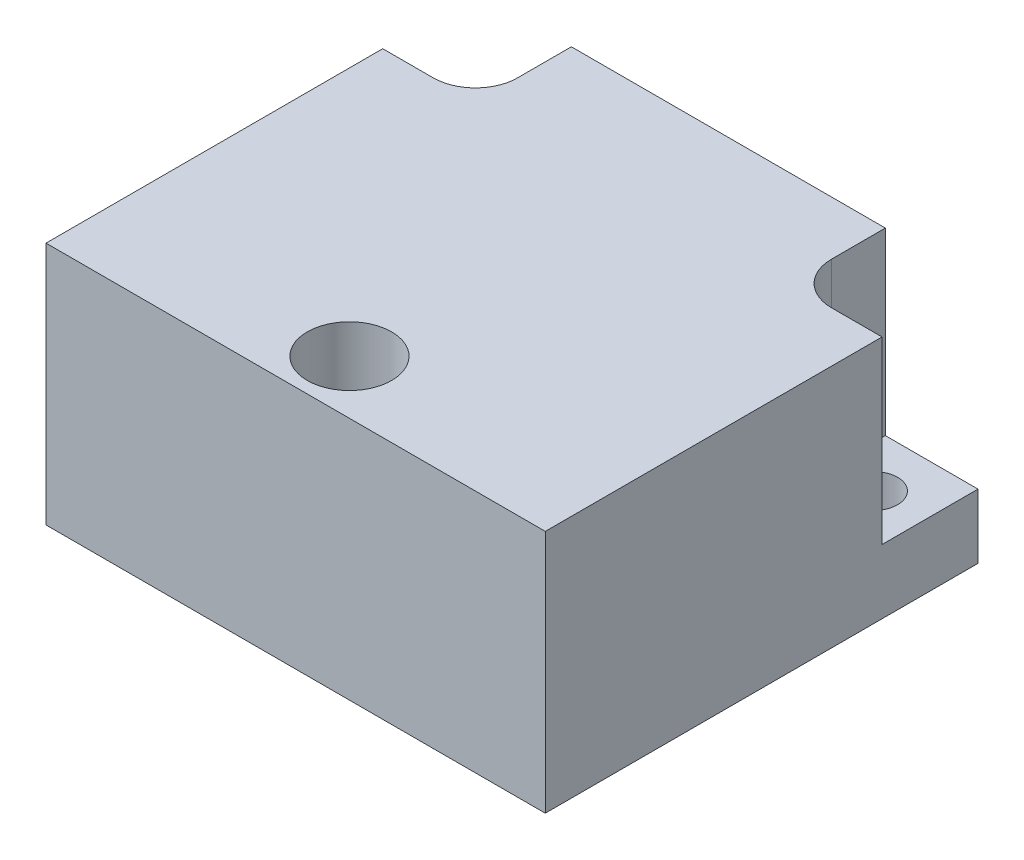
ISO-10303-21;
HEADER;
FILE_DESCRIPTION(('STEP AP214'),'2;1');
FILE_NAME('part.step','',(''),(''),'','','');
FILE_SCHEMA(('AUTOMOTIVE_DESIGN { 1 0 10303 214 1 1 1 1 }'));
ENDSEC;
DATA;
#1=APPLICATION_CONTEXT('core data for automotive mechanical design processes');
#2=APPLICATION_PROTOCOL_DEFINITION('international standard','automotive_design',2000,#1);
#3=PRODUCT_CONTEXT('',#1,'mechanical');
#4=PRODUCT('Part','Part','',(#3));
#5=PRODUCT_RELATED_PRODUCT_CATEGORY('part','',(#4));
#6=PRODUCT_DEFINITION_FORMATION('','',#4);
#7=PRODUCT_DEFINITION_CONTEXT('part definition',#1,'design');
#8=PRODUCT_DEFINITION('design','',#6,#7);
#9=PRODUCT_DEFINITION_SHAPE('','',#8);
#10=(LENGTH_UNIT() NAMED_UNIT(*) SI_UNIT(.MILLI.,.METRE.));
#11=(NAMED_UNIT(*) PLANE_ANGLE_UNIT() SI_UNIT($,.RADIAN.));
#12=(NAMED_UNIT(*) SI_UNIT($,.STERADIAN.) SOLID_ANGLE_UNIT());
#13=UNCERTAINTY_MEASURE_WITH_UNIT(LENGTH_MEASURE(1.E-05),#10,'distance_accuracy_value','');
#14=(GEOMETRIC_REPRESENTATION_CONTEXT(3) GLOBAL_UNCERTAINTY_ASSIGNED_CONTEXT((#13)) GLOBAL_UNIT_ASSIGNED_CONTEXT((#10,
#11,#12)) REPRESENTATION_CONTEXT('',''));
#15=CARTESIAN_POINT('',(0.,0.,0.));
#16=DIRECTION('',(0.,0.,1.));
#17=DIRECTION('',(1.,0.,0.));
#18=AXIS2_PLACEMENT_3D('',#15,#16,#17);
#19=CARTESIAN_POINT('',(-17.95,0.,-14.65));
#20=DIRECTION('',(0.,-1.,0.));
#21=DIRECTION('',(0.,0.,-1.));
#22=AXIS2_PLACEMENT_3D('',#19,#20,#21);
#23=CYLINDRICAL_SURFACE('',#22,2.15);
#24=CARTESIAN_POINT('',(-17.95,0.,-14.65));
#25=DIRECTION('',(0.,-1.,0.));
#26=DIRECTION('',(0.,0.,-1.));
#27=AXIS2_PLACEMENT_3D('',#24,#25,#26);
#28=CIRCLE('',#27,2.15);
#29=CARTESIAN_POINT('',(-17.95,0.,-16.8));
#30=VERTEX_POINT('',#29);
#31=EDGE_CURVE('E205',#30,#30,#28,.T.);
#32=ORIENTED_EDGE('',*,*,#31,.T.);
#33=EDGE_LOOP('',(#32));
#34=FACE_BOUND('',#33,.T.);
#35=CARTESIAN_POINT('',(-17.95,5.8,-14.65));
#36=DIRECTION('',(0.,1.,0.));
#37=DIRECTION('',(0.,0.,1.));
#38=AXIS2_PLACEMENT_3D('',#35,#36,#37);
#39=CIRCLE('',#38,2.15);
#40=CARTESIAN_POINT('',(-17.95,5.8,-12.5));
#41=VERTEX_POINT('',#40);
#42=EDGE_CURVE('E40',#41,#41,#39,.F.);
#43=ORIENTED_EDGE('',*,*,#42,.F.);
#44=EDGE_LOOP('',(#43));
#45=FACE_BOUND('',#44,.T.);
#46=ADVANCED_FACE('F36',(#34,#45),#23,.F.);
#47=CARTESIAN_POINT('',(0.,0.,14.65));
#48=DIRECTION('',(0.,-1.,0.));
#49=DIRECTION('',(0.,0.,-1.));
#50=AXIS2_PLACEMENT_3D('',#47,#48,#49);
#51=CYLINDRICAL_SURFACE('',#50,2.15);
#52=CARTESIAN_POINT('',(0.,0.,14.65));
#53=DIRECTION('',(0.,-1.,0.));
#54=DIRECTION('',(0.,0.,-1.));
#55=AXIS2_PLACEMENT_3D('',#52,#53,#54);
#56=CIRCLE('',#55,2.15);
#57=CARTESIAN_POINT('',(0.,0.,12.5));
#58=VERTEX_POINT('',#57);
#59=EDGE_CURVE('E199',#58,#58,#56,.T.);
#60=ORIENTED_EDGE('',*,*,#59,.T.);
#61=EDGE_LOOP('',(#60));
#62=FACE_BOUND('',#61,.T.);
#63=CARTESIAN_POINT('',(0.,5.8,14.65));
#64=DIRECTION('',(0.,1.,0.));
#65=DIRECTION('',(0.,0.,1.));
#66=AXIS2_PLACEMENT_3D('',#63,#64,#65);
#67=CIRCLE('',#66,2.15);
#68=CARTESIAN_POINT('',(0.,5.8,16.8));
#69=VERTEX_POINT('',#68);
#70=EDGE_CURVE('E168',#69,#69,#67,.F.);
#71=ORIENTED_EDGE('',*,*,#70,.F.);
#72=EDGE_LOOP('',(#71));
#73=FACE_BOUND('',#72,.T.);
#74=ADVANCED_FACE('F241',(#62,#73),#51,.F.);
#75=CARTESIAN_POINT('',(17.95,0.,-14.65));
#76=DIRECTION('',(0.,-1.,0.));
#77=DIRECTION('',(0.,0.,-1.));
#78=AXIS2_PLACEMENT_3D('',#75,#76,#77);
#79=CYLINDRICAL_SURFACE('',#78,2.15);
#80=CARTESIAN_POINT('',(17.95,0.,-14.65));
#81=DIRECTION('',(0.,-1.,0.));
#82=DIRECTION('',(0.,0.,-1.));
#83=AXIS2_PLACEMENT_3D('',#80,#81,#82);
#84=CIRCLE('',#83,2.15);
#85=CARTESIAN_POINT('',(17.95,0.,-16.8));
#86=VERTEX_POINT('',#85);
#87=EDGE_CURVE('E202',#86,#86,#84,.T.);
#88=ORIENTED_EDGE('',*,*,#87,.T.);
#89=EDGE_LOOP('',(#88));
#90=FACE_BOUND('',#89,.T.);
#91=CARTESIAN_POINT('',(17.95,5.8,-14.65));
#92=DIRECTION('',(0.,1.,0.));
#93=DIRECTION('',(0.,0.,1.));
#94=AXIS2_PLACEMENT_3D('',#91,#92,#93);
#95=CIRCLE('',#94,2.15);
#96=CARTESIAN_POINT('',(17.95,5.8,-12.5));
#97=VERTEX_POINT('',#96);
#98=EDGE_CURVE('E187',#97,#97,#95,.F.);
#99=ORIENTED_EDGE('',*,*,#98,.F.);
#100=EDGE_LOOP('',(#99));
#101=FACE_BOUND('',#100,.T.);
#102=ADVANCED_FACE('F243',(#90,#101),#79,.F.);
#103=CARTESIAN_POINT('',(22.5,22.,19.5));
#104=DIRECTION('',(-1.,0.,0.));
#105=DIRECTION('',(0.,0.,1.));
#106=AXIS2_PLACEMENT_3D('',#103,#104,#105);
#107=PLANE('',#106);
#108=DIRECTION('',(0.,0.,-1.));
#109=VECTOR('',#108,1.);
#110=CARTESIAN_POINT('',(22.5,5.8,19.5));
#111=LINE('',#110,#109);
#112=CARTESIAN_POINT('',(22.5,5.8,-10.85));
#113=VERTEX_POINT('',#112);
#114=CARTESIAN_POINT('',(22.5,5.8,-19.5));
#115=VERTEX_POINT('',#114);
#116=EDGE_CURVE('E191',#113,#115,#111,.T.);
#117=ORIENTED_EDGE('',*,*,#116,.F.);
#118=DIRECTION('',(0.,1.,0.));
#119=VECTOR('',#118,1.);
#120=CARTESIAN_POINT('',(22.5,22.,-10.85));
#121=LINE('',#120,#119);
#122=CARTESIAN_POINT('',(22.5,22.,-10.85));
#123=VERTEX_POINT('',#122);
#124=EDGE_CURVE('E193',#113,#123,#121,.T.);
#125=ORIENTED_EDGE('',*,*,#124,.T.);
#126=DIRECTION('',(0.,0.,-1.));
#127=VECTOR('',#126,1.);
#128=CARTESIAN_POINT('',(22.5,22.,19.5));
#129=LINE('',#128,#127);
#130=CARTESIAN_POINT('',(22.5,22.,19.5));
#131=VERTEX_POINT('',#130);
#132=EDGE_CURVE('E209',#131,#123,#129,.T.);
#133=ORIENTED_EDGE('',*,*,#132,.F.);
#134=DIRECTION('',(0.,-1.,0.));
#135=VECTOR('',#134,1.);
#136=CARTESIAN_POINT('',(22.5,22.,19.5));
#137=LINE('',#136,#135);
#138=CARTESIAN_POINT('',(22.5,0.,19.5));
#139=VERTEX_POINT('',#138);
#140=EDGE_CURVE('E220',#131,#139,#137,.T.);
#141=ORIENTED_EDGE('',*,*,#140,.T.);
#142=DIRECTION('',(0.,0.,-1.));
#143=VECTOR('',#142,1.);
#144=CARTESIAN_POINT('',(22.5,0.,19.5));
#145=LINE('',#144,#143);
#146=CARTESIAN_POINT('',(22.5,0.,-19.5));
#147=VERTEX_POINT('',#146);
#148=EDGE_CURVE('E208',#139,#147,#145,.T.);
#149=ORIENTED_EDGE('',*,*,#148,.T.);
#150=DIRECTION('',(0.,-1.,0.));
#151=VECTOR('',#150,1.);
#152=CARTESIAN_POINT('',(22.5,22.,-19.5));
#153=LINE('',#152,#151);
#154=EDGE_CURVE('E11',#115,#147,#153,.T.);
#155=ORIENTED_EDGE('',*,*,#154,.F.);
#156=EDGE_LOOP('',(#117,#125,#133,#141,#149,#155));
#157=FACE_BOUND('',#156,.T.);
#158=ADVANCED_FACE('F38',(#157),#107,.F.);
#159=CARTESIAN_POINT('',(-22.5,22.,-19.5));
#160=DIRECTION('',(0.,0.,1.));
#161=DIRECTION('',(1.,0.,0.));
#162=AXIS2_PLACEMENT_3D('',#159,#160,#161);
#163=PLANE('',#162);
#164=DIRECTION('',(-1.,0.,0.));
#165=VECTOR('',#164,1.);
#166=CARTESIAN_POINT('',(-22.5,5.8,-19.5));
#167=LINE('',#166,#165);
#168=CARTESIAN_POINT('',(-14.15,5.8,-19.5));
#169=VERTEX_POINT('',#168);
#170=CARTESIAN_POINT('',(-22.5,5.8,-19.5));
#171=VERTEX_POINT('',#170);
#172=EDGE_CURVE('E158',#169,#171,#167,.T.);
#173=ORIENTED_EDGE('',*,*,#172,.F.);
#174=DIRECTION('',(0.,1.,0.));
#175=VECTOR('',#174,1.);
#176=CARTESIAN_POINT('',(-14.15,22.,-19.5));
#177=LINE('',#176,#175);
#178=CARTESIAN_POINT('',(-14.15,22.,-19.5));
#179=VERTEX_POINT('',#178);
#180=EDGE_CURVE('E140',#169,#179,#177,.T.);
#181=ORIENTED_EDGE('',*,*,#180,.T.);
#182=DIRECTION('',(-1.,0.,0.));
#183=VECTOR('',#182,1.);
#184=CARTESIAN_POINT('',(-22.5,22.,-19.5));
#185=LINE('',#184,#183);
#186=CARTESIAN_POINT('',(14.15,22.,-19.5));
#187=VERTEX_POINT('',#186);
#188=EDGE_CURVE('E212',#187,#179,#185,.T.);
#189=ORIENTED_EDGE('',*,*,#188,.F.);
#190=DIRECTION('',(0.,-1.,0.));
#191=VECTOR('',#190,1.);
#192=CARTESIAN_POINT('',(14.15,22.,-19.5));
#193=LINE('',#192,#191);
#194=CARTESIAN_POINT('',(14.15,5.8,-19.5));
#195=VERTEX_POINT('',#194);
#196=EDGE_CURVE('E196',#187,#195,#193,.T.);
#197=ORIENTED_EDGE('',*,*,#196,.T.);
#198=DIRECTION('',(-1.,0.,0.));
#199=VECTOR('',#198,1.);
#200=CARTESIAN_POINT('',(-22.5,5.8,-19.5));
#201=LINE('',#200,#199);
#202=EDGE_CURVE('E189',#115,#195,#201,.T.);
#203=ORIENTED_EDGE('',*,*,#202,.F.);
#204=ORIENTED_EDGE('',*,*,#154,.T.);
#205=DIRECTION('',(-1.,0.,0.));
#206=VECTOR('',#205,1.);
#207=CARTESIAN_POINT('',(-22.5,0.,-19.5));
#208=LINE('',#207,#206);
#209=CARTESIAN_POINT('',(-22.5,0.,-19.5));
#210=VERTEX_POINT('',#209);
#211=EDGE_CURVE('E223',#147,#210,#208,.T.);
#212=ORIENTED_EDGE('',*,*,#211,.T.);
#213=DIRECTION('',(0.,-1.,0.));
#214=VECTOR('',#213,1.);
#215=CARTESIAN_POINT('',(-22.5,22.,-19.5));
#216=LINE('',#215,#214);
#217=EDGE_CURVE('E45',#171,#210,#216,.T.);
#218=ORIENTED_EDGE('',*,*,#217,.F.);
#219=EDGE_LOOP('',(#173,#181,#189,#197,#203,#204,#212,#218));
#220=FACE_BOUND('',#219,.T.);
#221=ADVANCED_FACE('F273',(#220),#163,.F.);
#222=CARTESIAN_POINT('',(-22.5,22.,19.5));
#223=DIRECTION('',(1.,0.,0.));
#224=DIRECTION('',(0.,0.,-1.));
#225=AXIS2_PLACEMENT_3D('',#222,#223,#224);
#226=PLANE('',#225);
#227=DIRECTION('',(0.,0.,1.));
#228=VECTOR('',#227,1.);
#229=CARTESIAN_POINT('',(-22.5,22.,19.5));
#230=LINE('',#229,#228);
#231=CARTESIAN_POINT('',(-22.5,22.,-10.85));
#232=VERTEX_POINT('',#231);
#233=CARTESIAN_POINT('',(-22.5,22.,19.5));
#234=VERTEX_POINT('',#233);
#235=EDGE_CURVE('E216',#232,#234,#230,.T.);
#236=ORIENTED_EDGE('',*,*,#235,.F.);
#237=DIRECTION('',(0.,-1.,0.));
#238=VECTOR('',#237,1.);
#239=CARTESIAN_POINT('',(-22.5,22.,-10.85));
#240=LINE('',#239,#238);
#241=CARTESIAN_POINT('',(-22.5,5.8,-10.85));
#242=VERTEX_POINT('',#241);
#243=EDGE_CURVE('E161',#232,#242,#240,.T.);
#244=ORIENTED_EDGE('',*,*,#243,.T.);
#245=DIRECTION('',(0.,0.,1.));
#246=VECTOR('',#245,1.);
#247=CARTESIAN_POINT('',(-22.5,5.8,19.5));
#248=LINE('',#247,#246);
#249=EDGE_CURVE('E156',#171,#242,#248,.T.);
#250=ORIENTED_EDGE('',*,*,#249,.F.);
#251=ORIENTED_EDGE('',*,*,#217,.T.);
#252=DIRECTION('',(0.,0.,1.));
#253=VECTOR('',#252,1.);
#254=CARTESIAN_POINT('',(-22.5,0.,19.5));
#255=LINE('',#254,#253);
#256=CARTESIAN_POINT('',(-22.5,0.,19.5));
#257=VERTEX_POINT('',#256);
#258=EDGE_CURVE('E226',#210,#257,#255,.T.);
#259=ORIENTED_EDGE('',*,*,#258,.T.);
#260=DIRECTION('',(0.,-1.,0.));
#261=VECTOR('',#260,1.);
#262=CARTESIAN_POINT('',(-22.5,22.,19.5));
#263=LINE('',#262,#261);
#264=EDGE_CURVE('E231',#234,#257,#263,.T.);
#265=ORIENTED_EDGE('',*,*,#264,.F.);
#266=EDGE_LOOP('',(#236,#244,#250,#251,#259,#265));
#267=FACE_BOUND('',#266,.T.);
#268=ADVANCED_FACE('F270',(#267),#226,.F.);
#269=CARTESIAN_POINT('',(-22.5,22.,19.5));
#270=DIRECTION('',(0.,0.,-1.));
#271=DIRECTION('',(-1.,0.,0.));
#272=AXIS2_PLACEMENT_3D('',#269,#270,#271);
#273=PLANE('',#272);
#274=DIRECTION('',(1.,0.,0.));
#275=VECTOR('',#274,1.);
#276=CARTESIAN_POINT('',(-22.5,0.,19.5));
#277=LINE('',#276,#275);
#278=EDGE_CURVE('E213',#257,#139,#277,.T.);
#279=ORIENTED_EDGE('',*,*,#278,.T.);
#280=ORIENTED_EDGE('',*,*,#140,.F.);
#281=DIRECTION('',(1.,0.,0.));
#282=VECTOR('',#281,1.);
#283=CARTESIAN_POINT('',(-22.5,22.,19.5));
#284=LINE('',#283,#282);
#285=EDGE_CURVE('E218',#234,#131,#284,.T.);
#286=ORIENTED_EDGE('',*,*,#285,.F.);
#287=ORIENTED_EDGE('',*,*,#264,.T.);
#288=EDGE_LOOP('',(#279,#280,#286,#287));
#289=FACE_BOUND('',#288,.T.);
#290=ADVANCED_FACE('F262',(#289),#273,.F.);
#291=CARTESIAN_POINT('',(0.,22.,0.));
#292=DIRECTION('',(0.,-1.,0.));
#293=DIRECTION('',(0.,0.,-1.));
#294=AXIS2_PLACEMENT_3D('',#291,#292,#293);
#295=PLANE('',#294);
#296=CARTESIAN_POINT('',(0.,22.,14.65));
#297=DIRECTION('',(0.,1.,0.));
#298=DIRECTION('',(0.,0.,1.));
#299=AXIS2_PLACEMENT_3D('',#296,#297,#298);
#300=CIRCLE('',#299,3.8);
#301=CARTESIAN_POINT('',(0.,22.,18.45));
#302=VERTEX_POINT('',#301);
#303=EDGE_CURVE('E164',#302,#302,#300,.T.);
#304=ORIENTED_EDGE('',*,*,#303,.F.);
#305=EDGE_LOOP('',(#304));
#306=FACE_BOUND('',#305,.T.);
#307=CARTESIAN_POINT('',(-17.95,22.,-14.65));
#308=DIRECTION('',(0.,1.,0.));
#309=DIRECTION('',(0.,0.,1.));
#310=AXIS2_PLACEMENT_3D('',#307,#308,#309);
#311=CIRCLE('',#310,3.8);
#312=CARTESIAN_POINT('',(-17.95,22.,-10.85));
#313=VERTEX_POINT('',#312);
#314=CARTESIAN_POINT('',(-14.15,22.,-14.65));
#315=VERTEX_POINT('',#314);
#316=EDGE_CURVE('E53',#313,#315,#311,.T.);
#317=ORIENTED_EDGE('',*,*,#316,.F.);
#318=DIRECTION('',(1.,0.,0.));
#319=VECTOR('',#318,1.);
#320=CARTESIAN_POINT('',(-25.55,22.,-10.85));
#321=LINE('',#320,#319);
#322=EDGE_CURVE('E147',#232,#313,#321,.T.);
#323=ORIENTED_EDGE('',*,*,#322,.F.);
#324=ORIENTED_EDGE('',*,*,#235,.T.);
#325=ORIENTED_EDGE('',*,*,#285,.T.);
#326=ORIENTED_EDGE('',*,*,#132,.T.);
#327=DIRECTION('',(1.,0.,0.));
#328=VECTOR('',#327,1.);
#329=CARTESIAN_POINT('',(17.95,22.,-10.85));
#330=LINE('',#329,#328);
#331=CARTESIAN_POINT('',(17.95,22.,-10.85));
#332=VERTEX_POINT('',#331);
#333=EDGE_CURVE('E182',#332,#123,#330,.T.);
#334=ORIENTED_EDGE('',*,*,#333,.F.);
#335=CARTESIAN_POINT('',(17.95,22.,-14.65));
#336=DIRECTION('',(0.,1.,0.));
#337=DIRECTION('',(0.,0.,1.));
#338=AXIS2_PLACEMENT_3D('',#335,#336,#337);
#339=CIRCLE('',#338,3.8);
#340=CARTESIAN_POINT('',(14.15,22.,-14.65));
#341=VERTEX_POINT('',#340);
#342=EDGE_CURVE('E61',#341,#332,#339,.T.);
#343=ORIENTED_EDGE('',*,*,#342,.F.);
#344=DIRECTION('',(0.,0.,1.));
#345=VECTOR('',#344,1.);
#346=CARTESIAN_POINT('',(14.15,22.,-22.25));
#347=LINE('',#346,#345);
#348=EDGE_CURVE('E175',#187,#341,#347,.T.);
#349=ORIENTED_EDGE('',*,*,#348,.F.);
#350=ORIENTED_EDGE('',*,*,#188,.T.);
#351=DIRECTION('',(0.,0.,-1.));
#352=VECTOR('',#351,1.);
#353=CARTESIAN_POINT('',(-14.15,22.,-14.65));
#354=LINE('',#353,#352);
#355=EDGE_CURVE('E149',#315,#179,#354,.T.);
#356=ORIENTED_EDGE('',*,*,#355,.F.);
#357=EDGE_LOOP('',(#317,#323,#324,#325,#326,#334,#343,#349,#350,#356));
#358=FACE_BOUND('',#357,.T.);
#359=ADVANCED_FACE('F258',(#306,#358),#295,.F.);
#360=CARTESIAN_POINT('',(0.,0.,0.));
#361=DIRECTION('',(0.,-1.,0.));
#362=DIRECTION('',(0.,0.,-1.));
#363=AXIS2_PLACEMENT_3D('',#360,#361,#362);
#364=PLANE('',#363);
#365=ORIENTED_EDGE('',*,*,#59,.F.);
#366=EDGE_LOOP('',(#365));
#367=FACE_BOUND('',#366,.T.);
#368=ORIENTED_EDGE('',*,*,#87,.F.);
#369=EDGE_LOOP('',(#368));
#370=FACE_BOUND('',#369,.T.);
#371=ORIENTED_EDGE('',*,*,#31,.F.);
#372=EDGE_LOOP('',(#371));
#373=FACE_BOUND('',#372,.T.);
#374=ORIENTED_EDGE('',*,*,#148,.F.);
#375=ORIENTED_EDGE('',*,*,#278,.F.);
#376=ORIENTED_EDGE('',*,*,#258,.F.);
#377=ORIENTED_EDGE('',*,*,#211,.F.);
#378=EDGE_LOOP('',(#374,#375,#376,#377));
#379=FACE_BOUND('',#378,.T.);
#380=ADVANCED_FACE('F261',(#367,#370,#373,#379),#364,.T.);
#381=CARTESIAN_POINT('',(14.15,5.8,-22.25));
#382=DIRECTION('',(-1.,0.,0.));
#383=DIRECTION('',(0.,0.,1.));
#384=AXIS2_PLACEMENT_3D('',#381,#382,#383);
#385=PLANE('',#384);
#386=ORIENTED_EDGE('',*,*,#348,.T.);
#387=DIRECTION('',(0.,1.,0.));
#388=VECTOR('',#387,1.);
#389=CARTESIAN_POINT('',(14.15,5.8,-14.65));
#390=LINE('',#389,#388);
#391=CARTESIAN_POINT('',(14.15,5.8,-14.65));
#392=VERTEX_POINT('',#391);
#393=EDGE_CURVE('E185',#392,#341,#390,.T.);
#394=ORIENTED_EDGE('',*,*,#393,.F.);
#395=DIRECTION('',(0.,0.,1.));
#396=VECTOR('',#395,1.);
#397=CARTESIAN_POINT('',(14.15,5.8,-22.25));
#398=LINE('',#397,#396);
#399=EDGE_CURVE('E178',#195,#392,#398,.T.);
#400=ORIENTED_EDGE('',*,*,#399,.F.);
#401=ORIENTED_EDGE('',*,*,#196,.F.);
#402=EDGE_LOOP('',(#386,#394,#400,#401));
#403=FACE_BOUND('',#402,.T.);
#404=ADVANCED_FACE('F266',(#403),#385,.F.);
#405=CARTESIAN_POINT('',(17.95,5.8,-10.85));
#406=DIRECTION('',(0.,0.,1.));
#407=DIRECTION('',(1.,0.,0.));
#408=AXIS2_PLACEMENT_3D('',#405,#406,#407);
#409=PLANE('',#408);
#410=DIRECTION('',(1.,0.,0.));
#411=VECTOR('',#410,1.);
#412=CARTESIAN_POINT('',(17.95,5.8,-10.85));
#413=LINE('',#412,#411);
#414=CARTESIAN_POINT('',(17.95,5.8,-10.85));
#415=VERTEX_POINT('',#414);
#416=EDGE_CURVE('E174',#415,#113,#413,.T.);
#417=ORIENTED_EDGE('',*,*,#416,.F.);
#418=DIRECTION('',(0.,1.,0.));
#419=VECTOR('',#418,1.);
#420=CARTESIAN_POINT('',(17.95,5.8,-10.85));
#421=LINE('',#420,#419);
#422=EDGE_CURVE('E180',#415,#332,#421,.T.);
#423=ORIENTED_EDGE('',*,*,#422,.T.);
#424=ORIENTED_EDGE('',*,*,#333,.T.);
#425=ORIENTED_EDGE('',*,*,#124,.F.);
#426=EDGE_LOOP('',(#417,#423,#424,#425));
#427=FACE_BOUND('',#426,.T.);
#428=ADVANCED_FACE('F311',(#427),#409,.F.);
#429=CARTESIAN_POINT('',(17.95,5.8,-14.65));
#430=DIRECTION('',(0.,1.,0.));
#431=DIRECTION('',(0.,0.,1.));
#432=AXIS2_PLACEMENT_3D('',#429,#430,#431);
#433=PLANE('',#432);
#434=ORIENTED_EDGE('',*,*,#98,.T.);
#435=EDGE_LOOP('',(#434));
#436=FACE_BOUND('',#435,.T.);
#437=ORIENTED_EDGE('',*,*,#116,.T.);
#438=ORIENTED_EDGE('',*,*,#202,.T.);
#439=ORIENTED_EDGE('',*,*,#399,.T.);
#440=CARTESIAN_POINT('',(17.95,5.8,-14.65));
#441=DIRECTION('',(0.,1.,0.));
#442=DIRECTION('',(0.,0.,1.));
#443=AXIS2_PLACEMENT_3D('',#440,#441,#442);
#444=CIRCLE('',#443,3.8);
#445=EDGE_CURVE('E171',#392,#415,#444,.T.);
#446=ORIENTED_EDGE('',*,*,#445,.T.);
#447=ORIENTED_EDGE('',*,*,#416,.T.);
#448=EDGE_LOOP('',(#437,#438,#439,#446,#447));
#449=FACE_BOUND('',#448,.T.);
#450=ADVANCED_FACE('F298',(#436,#449),#433,.T.);
#451=CARTESIAN_POINT('',(17.95,5.8,-14.65));
#452=DIRECTION('',(0.,1.,0.));
#453=DIRECTION('',(0.,0.,1.));
#454=AXIS2_PLACEMENT_3D('',#451,#452,#453);
#455=CYLINDRICAL_SURFACE('',#454,3.8);
#456=ORIENTED_EDGE('',*,*,#342,.T.);
#457=ORIENTED_EDGE('',*,*,#422,.F.);
#458=ORIENTED_EDGE('',*,*,#445,.F.);
#459=ORIENTED_EDGE('',*,*,#393,.T.);
#460=EDGE_LOOP('',(#456,#457,#458,#459));
#461=FACE_BOUND('',#460,.T.);
#462=ADVANCED_FACE('F255',(#461),#455,.F.);
#463=CARTESIAN_POINT('',(0.,5.8,14.65));
#464=DIRECTION('',(0.,1.,0.));
#465=DIRECTION('',(0.,0.,1.));
#466=AXIS2_PLACEMENT_3D('',#463,#464,#465);
#467=PLANE('',#466);
#468=CARTESIAN_POINT('',(0.,5.8,14.65));
#469=DIRECTION('',(0.,1.,0.));
#470=DIRECTION('',(0.,0.,1.));
#471=AXIS2_PLACEMENT_3D('',#468,#469,#470);
#472=CIRCLE('',#471,3.8);
#473=CARTESIAN_POINT('',(0.,5.8,18.45));
#474=VERTEX_POINT('',#473);
#475=EDGE_CURVE('E165',#474,#474,#472,.T.);
#476=ORIENTED_EDGE('',*,*,#475,.T.);
#477=EDGE_LOOP('',(#476));
#478=FACE_BOUND('',#477,.T.);
#479=ORIENTED_EDGE('',*,*,#70,.T.);
#480=EDGE_LOOP('',(#479));
#481=FACE_BOUND('',#480,.T.);
#482=ADVANCED_FACE('F239',(#478,#481),#467,.T.);
#483=CARTESIAN_POINT('',(0.,5.8,14.65));
#484=DIRECTION('',(0.,1.,0.));
#485=DIRECTION('',(0.,0.,1.));
#486=AXIS2_PLACEMENT_3D('',#483,#484,#485);
#487=CYLINDRICAL_SURFACE('',#486,3.8);
#488=ORIENTED_EDGE('',*,*,#475,.F.);
#489=EDGE_LOOP('',(#488));
#490=FACE_BOUND('',#489,.T.);
#491=ORIENTED_EDGE('',*,*,#303,.T.);
#492=EDGE_LOOP('',(#491));
#493=FACE_BOUND('',#492,.T.);
#494=ADVANCED_FACE('F317',(#490,#493),#487,.F.);
#495=CARTESIAN_POINT('',(-25.55,5.8,-10.85));
#496=DIRECTION('',(0.,0.,1.));
#497=DIRECTION('',(1.,0.,0.));
#498=AXIS2_PLACEMENT_3D('',#495,#496,#497);
#499=PLANE('',#498);
#500=ORIENTED_EDGE('',*,*,#322,.T.);
#501=DIRECTION('',(0.,1.,0.));
#502=VECTOR('',#501,1.);
#503=CARTESIAN_POINT('',(-17.95,5.8,-10.85));
#504=LINE('',#503,#502);
#505=CARTESIAN_POINT('',(-17.95,5.8,-10.85));
#506=VERTEX_POINT('',#505);
#507=EDGE_CURVE('E133',#506,#313,#504,.T.);
#508=ORIENTED_EDGE('',*,*,#507,.F.);
#509=DIRECTION('',(1.,0.,0.));
#510=VECTOR('',#509,1.);
#511=CARTESIAN_POINT('',(-25.55,5.8,-10.85));
#512=LINE('',#511,#510);
#513=EDGE_CURVE('E134',#242,#506,#512,.T.);
#514=ORIENTED_EDGE('',*,*,#513,.F.);
#515=ORIENTED_EDGE('',*,*,#243,.F.);
#516=EDGE_LOOP('',(#500,#508,#514,#515));
#517=FACE_BOUND('',#516,.T.);
#518=ADVANCED_FACE('F288',(#517),#499,.F.);
#519=CARTESIAN_POINT('',(-14.15,5.8,-14.65));
#520=DIRECTION('',(1.,0.,0.));
#521=DIRECTION('',(0.,0.,-1.));
#522=AXIS2_PLACEMENT_3D('',#519,#520,#521);
#523=PLANE('',#522);
#524=DIRECTION('',(0.,0.,-1.));
#525=VECTOR('',#524,1.);
#526=CARTESIAN_POINT('',(-14.15,5.8,-14.65));
#527=LINE('',#526,#525);
#528=CARTESIAN_POINT('',(-14.15,5.8,-14.65));
#529=VERTEX_POINT('',#528);
#530=EDGE_CURVE('E137',#529,#169,#527,.T.);
#531=ORIENTED_EDGE('',*,*,#530,.F.);
#532=DIRECTION('',(0.,1.,0.));
#533=VECTOR('',#532,1.);
#534=CARTESIAN_POINT('',(-14.15,5.8,-14.65));
#535=LINE('',#534,#533);
#536=EDGE_CURVE('E126',#529,#315,#535,.T.);
#537=ORIENTED_EDGE('',*,*,#536,.T.);
#538=ORIENTED_EDGE('',*,*,#355,.T.);
#539=ORIENTED_EDGE('',*,*,#180,.F.);
#540=EDGE_LOOP('',(#531,#537,#538,#539));
#541=FACE_BOUND('',#540,.T.);
#542=ADVANCED_FACE('F138',(#541),#523,.F.);
#543=CARTESIAN_POINT('',(-17.95,5.8,-14.65));
#544=DIRECTION('',(0.,1.,0.));
#545=DIRECTION('',(0.,0.,1.));
#546=AXIS2_PLACEMENT_3D('',#543,#544,#545);
#547=PLANE('',#546);
#548=ORIENTED_EDGE('',*,*,#42,.T.);
#549=EDGE_LOOP('',(#548));
#550=FACE_BOUND('',#549,.T.);
#551=ORIENTED_EDGE('',*,*,#172,.T.);
#552=ORIENTED_EDGE('',*,*,#249,.T.);
#553=ORIENTED_EDGE('',*,*,#513,.T.);
#554=CARTESIAN_POINT('',(-17.95,5.8,-14.65));
#555=DIRECTION('',(0.,1.,0.));
#556=DIRECTION('',(0.,0.,1.));
#557=AXIS2_PLACEMENT_3D('',#554,#555,#556);
#558=CIRCLE('',#557,3.8);
#559=EDGE_CURVE('E130',#506,#529,#558,.T.);
#560=ORIENTED_EDGE('',*,*,#559,.T.);
#561=ORIENTED_EDGE('',*,*,#530,.T.);
#562=EDGE_LOOP('',(#551,#552,#553,#560,#561));
#563=FACE_BOUND('',#562,.T.);
#564=ADVANCED_FACE('F144',(#550,#563),#547,.T.);
#565=CARTESIAN_POINT('',(-17.95,5.8,-14.65));
#566=DIRECTION('',(0.,1.,0.));
#567=DIRECTION('',(0.,0.,1.));
#568=AXIS2_PLACEMENT_3D('',#565,#566,#567);
#569=CYLINDRICAL_SURFACE('',#568,3.8);
#570=ORIENTED_EDGE('',*,*,#316,.T.);
#571=ORIENTED_EDGE('',*,*,#536,.F.);
#572=ORIENTED_EDGE('',*,*,#559,.F.);
#573=ORIENTED_EDGE('',*,*,#507,.T.);
#574=EDGE_LOOP('',(#570,#571,#572,#573));
#575=FACE_BOUND('',#574,.T.);
#576=ADVANCED_FACE('F128',(#575),#569,.F.);
#577=CLOSED_SHELL('',(#46,#74,#102,#158,#221,#268,#290,#359,#380,#404,#428,#450,#462,#482,#494,
#518,#542,#564,#576));
#578=MANIFOLD_SOLID_BREP('B2',#577);
#579=ADVANCED_BREP_SHAPE_REPRESENTATION('',(#18,#578),#14);
#580=SHAPE_DEFINITION_REPRESENTATION(#9,#579);
ENDSEC;
END-ISO-10303-21;
